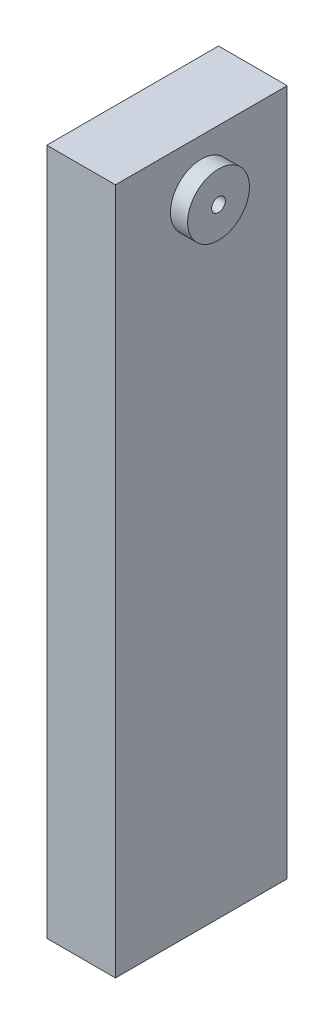
ISO-10303-21;
HEADER;
FILE_DESCRIPTION(('STEP AP214'),'2;1');
FILE_NAME('part.step','',(''),(''),'','','');
FILE_SCHEMA(('AUTOMOTIVE_DESIGN { 1 0 10303 214 1 1 1 1 }'));
ENDSEC;
DATA;
#1=APPLICATION_CONTEXT('core data for automotive mechanical design processes');
#2=APPLICATION_PROTOCOL_DEFINITION('international standard','automotive_design',2000,#1);
#3=PRODUCT_CONTEXT('',#1,'mechanical');
#4=PRODUCT('Part','Part','',(#3));
#5=PRODUCT_RELATED_PRODUCT_CATEGORY('part','',(#4));
#6=PRODUCT_DEFINITION_FORMATION('','',#4);
#7=PRODUCT_DEFINITION_CONTEXT('part definition',#1,'design');
#8=PRODUCT_DEFINITION('design','',#6,#7);
#9=PRODUCT_DEFINITION_SHAPE('','',#8);
#10=(LENGTH_UNIT() NAMED_UNIT(*) SI_UNIT(.MILLI.,.METRE.));
#11=(NAMED_UNIT(*) PLANE_ANGLE_UNIT() SI_UNIT($,.RADIAN.));
#12=(NAMED_UNIT(*) SI_UNIT($,.STERADIAN.) SOLID_ANGLE_UNIT());
#13=UNCERTAINTY_MEASURE_WITH_UNIT(LENGTH_MEASURE(1.E-05),#10,'distance_accuracy_value','');
#14=(GEOMETRIC_REPRESENTATION_CONTEXT(3) GLOBAL_UNCERTAINTY_ASSIGNED_CONTEXT((#13)) GLOBAL_UNIT_ASSIGNED_CONTEXT((#10,
#11,#12)) REPRESENTATION_CONTEXT('',''));
#15=CARTESIAN_POINT('',(0.,0.,0.));
#16=DIRECTION('',(0.,0.,1.));
#17=DIRECTION('',(1.,0.,0.));
#18=AXIS2_PLACEMENT_3D('',#15,#16,#17);
#19=CARTESIAN_POINT('',(-50.,1000.,125.));
#20=DIRECTION('',(1.,0.,0.));
#21=DIRECTION('',(0.,0.,-1.));
#22=AXIS2_PLACEMENT_3D('',#19,#20,#21);
#23=PLANE('',#22);
#24=DIRECTION('',(0.,0.,1.));
#25=VECTOR('',#24,1.);
#26=CARTESIAN_POINT('',(-50.,0.,125.));
#27=LINE('',#26,#25);
#28=CARTESIAN_POINT('',(-50.,0.,-125.));
#29=VERTEX_POINT('',#28);
#30=CARTESIAN_POINT('',(-50.,0.,125.));
#31=VERTEX_POINT('',#30);
#32=EDGE_CURVE('E102',#29,#31,#27,.T.);
#33=ORIENTED_EDGE('',*,*,#32,.T.);
#34=DIRECTION('',(0.,-1.,0.));
#35=VECTOR('',#34,1.);
#36=CARTESIAN_POINT('',(-50.,1000.,125.));
#37=LINE('',#36,#35);
#38=CARTESIAN_POINT('',(-50.,1000.,125.));
#39=VERTEX_POINT('',#38);
#40=EDGE_CURVE('E44',#39,#31,#37,.T.);
#41=ORIENTED_EDGE('',*,*,#40,.F.);
#42=DIRECTION('',(0.,0.,1.));
#43=VECTOR('',#42,1.);
#44=CARTESIAN_POINT('',(-50.,1000.,125.));
#45=LINE('',#44,#43);
#46=CARTESIAN_POINT('',(-50.,1000.,-125.));
#47=VERTEX_POINT('',#46);
#48=EDGE_CURVE('E88',#47,#39,#45,.T.);
#49=ORIENTED_EDGE('',*,*,#48,.F.);
#50=DIRECTION('',(0.,-1.,0.));
#51=VECTOR('',#50,1.);
#52=CARTESIAN_POINT('',(-50.,1000.,-125.));
#53=LINE('',#52,#51);
#54=EDGE_CURVE('E98',#47,#29,#53,.T.);
#55=ORIENTED_EDGE('',*,*,#54,.T.);
#56=EDGE_LOOP('',(#33,#41,#49,#55));
#57=FACE_BOUND('',#56,.T.);
#58=ADVANCED_FACE('F36',(#57),#23,.F.);
#59=CARTESIAN_POINT('',(50.,1000.,125.));
#60=DIRECTION('',(0.,0.,-1.));
#61=DIRECTION('',(-1.,0.,0.));
#62=AXIS2_PLACEMENT_3D('',#59,#60,#61);
#63=PLANE('',#62);
#64=DIRECTION('',(1.,0.,0.));
#65=VECTOR('',#64,1.);
#66=CARTESIAN_POINT('',(50.,0.,125.));
#67=LINE('',#66,#65);
#68=CARTESIAN_POINT('',(50.,0.,125.));
#69=VERTEX_POINT('',#68);
#70=EDGE_CURVE('E93',#31,#69,#67,.T.);
#71=ORIENTED_EDGE('',*,*,#70,.T.);
#72=DIRECTION('',(0.,-1.,0.));
#73=VECTOR('',#72,1.);
#74=CARTESIAN_POINT('',(50.,1000.,125.));
#75=LINE('',#74,#73);
#76=CARTESIAN_POINT('',(50.,1000.,125.));
#77=VERTEX_POINT('',#76);
#78=EDGE_CURVE('E91',#77,#69,#75,.T.);
#79=ORIENTED_EDGE('',*,*,#78,.F.);
#80=DIRECTION('',(1.,0.,0.));
#81=VECTOR('',#80,1.);
#82=CARTESIAN_POINT('',(50.,1000.,125.));
#83=LINE('',#82,#81);
#84=EDGE_CURVE('E83',#39,#77,#83,.T.);
#85=ORIENTED_EDGE('',*,*,#84,.F.);
#86=ORIENTED_EDGE('',*,*,#40,.T.);
#87=EDGE_LOOP('',(#71,#79,#85,#86));
#88=FACE_BOUND('',#87,.T.);
#89=ADVANCED_FACE('F92',(#88),#63,.F.);
#90=CARTESIAN_POINT('',(50.,1000.,125.));
#91=DIRECTION('',(-1.,0.,0.));
#92=DIRECTION('',(0.,0.,1.));
#93=AXIS2_PLACEMENT_3D('',#90,#91,#92);
#94=PLANE('',#93);
#95=CARTESIAN_POINT('',(50.,925.,0.));
#96=DIRECTION('',(-1.,0.,0.));
#97=DIRECTION('',(0.,0.,1.));
#98=AXIS2_PLACEMENT_3D('',#95,#96,#97);
#99=CIRCLE('',#98,45.);
#100=CARTESIAN_POINT('',(50.,925.,45.));
#101=VERTEX_POINT('',#100);
#102=EDGE_CURVE('E11',#101,#101,#99,.F.);
#103=ORIENTED_EDGE('',*,*,#102,.F.);
#104=EDGE_LOOP('',(#103));
#105=FACE_BOUND('',#104,.T.);
#106=DIRECTION('',(0.,0.,-1.));
#107=VECTOR('',#106,1.);
#108=CARTESIAN_POINT('',(50.,0.,125.));
#109=LINE('',#108,#107);
#110=CARTESIAN_POINT('',(50.,0.,-125.));
#111=VERTEX_POINT('',#110);
#112=EDGE_CURVE('E69',#69,#111,#109,.T.);
#113=ORIENTED_EDGE('',*,*,#112,.T.);
#114=DIRECTION('',(0.,-1.,0.));
#115=VECTOR('',#114,1.);
#116=CARTESIAN_POINT('',(50.,1000.,-125.));
#117=LINE('',#116,#115);
#118=CARTESIAN_POINT('',(50.,1000.,-125.));
#119=VERTEX_POINT('',#118);
#120=EDGE_CURVE('E94',#119,#111,#117,.T.);
#121=ORIENTED_EDGE('',*,*,#120,.F.);
#122=DIRECTION('',(0.,0.,-1.));
#123=VECTOR('',#122,1.);
#124=CARTESIAN_POINT('',(50.,1000.,125.));
#125=LINE('',#124,#123);
#126=EDGE_CURVE('E86',#77,#119,#125,.T.);
#127=ORIENTED_EDGE('',*,*,#126,.F.);
#128=ORIENTED_EDGE('',*,*,#78,.T.);
#129=EDGE_LOOP('',(#113,#121,#127,#128));
#130=FACE_BOUND('',#129,.T.);
#131=ADVANCED_FACE('F96',(#105,#130),#94,.F.);
#132=CARTESIAN_POINT('',(50.,1000.,-125.));
#133=DIRECTION('',(0.,0.,1.));
#134=DIRECTION('',(1.,0.,0.));
#135=AXIS2_PLACEMENT_3D('',#132,#133,#134);
#136=PLANE('',#135);
#137=DIRECTION('',(-1.,0.,0.));
#138=VECTOR('',#137,1.);
#139=CARTESIAN_POINT('',(50.,0.,-125.));
#140=LINE('',#139,#138);
#141=EDGE_CURVE('E75',#111,#29,#140,.T.);
#142=ORIENTED_EDGE('',*,*,#141,.T.);
#143=ORIENTED_EDGE('',*,*,#54,.F.);
#144=DIRECTION('',(-1.,0.,0.));
#145=VECTOR('',#144,1.);
#146=CARTESIAN_POINT('',(50.,1000.,-125.));
#147=LINE('',#146,#145);
#148=EDGE_CURVE('E52',#119,#47,#147,.T.);
#149=ORIENTED_EDGE('',*,*,#148,.F.);
#150=ORIENTED_EDGE('',*,*,#120,.T.);
#151=EDGE_LOOP('',(#142,#143,#149,#150));
#152=FACE_BOUND('',#151,.T.);
#153=ADVANCED_FACE('F124',(#152),#136,.F.);
#154=CARTESIAN_POINT('',(0.,1000.,0.));
#155=DIRECTION('',(0.,1.,0.));
#156=DIRECTION('',(0.,0.,1.));
#157=AXIS2_PLACEMENT_3D('',#154,#155,#156);
#158=PLANE('',#157);
#159=ORIENTED_EDGE('',*,*,#48,.T.);
#160=ORIENTED_EDGE('',*,*,#84,.T.);
#161=ORIENTED_EDGE('',*,*,#126,.T.);
#162=ORIENTED_EDGE('',*,*,#148,.T.);
#163=EDGE_LOOP('',(#159,#160,#161,#162));
#164=FACE_BOUND('',#163,.T.);
#165=ADVANCED_FACE('F84',(#164),#158,.T.);
#166=CARTESIAN_POINT('',(0.,0.,0.));
#167=DIRECTION('',(0.,1.,0.));
#168=DIRECTION('',(0.,0.,1.));
#169=AXIS2_PLACEMENT_3D('',#166,#167,#168);
#170=PLANE('',#169);
#171=ORIENTED_EDGE('',*,*,#32,.F.);
#172=ORIENTED_EDGE('',*,*,#141,.F.);
#173=ORIENTED_EDGE('',*,*,#112,.F.);
#174=ORIENTED_EDGE('',*,*,#70,.F.);
#175=EDGE_LOOP('',(#171,#172,#173,#174));
#176=FACE_BOUND('',#175,.T.);
#177=ADVANCED_FACE('F113',(#176),#170,.F.);
#178=CARTESIAN_POINT('',(75.,925.,0.));
#179=DIRECTION('',(-1.,0.,0.));
#180=DIRECTION('',(0.,0.,1.));
#181=AXIS2_PLACEMENT_3D('',#178,#179,#180);
#182=CYLINDRICAL_SURFACE('',#181,45.);
#183=CARTESIAN_POINT('',(75.,925.,0.));
#184=DIRECTION('',(1.,0.,0.));
#185=DIRECTION('',(0.,0.,-1.));
#186=AXIS2_PLACEMENT_3D('',#183,#184,#185);
#187=CIRCLE('',#186,45.);
#188=CARTESIAN_POINT('',(75.,925.,-45.));
#189=VERTEX_POINT('',#188);
#190=EDGE_CURVE('E105',#189,#189,#187,.T.);
#191=ORIENTED_EDGE('',*,*,#190,.F.);
#192=EDGE_LOOP('',(#191));
#193=FACE_BOUND('',#192,.T.);
#194=ORIENTED_EDGE('',*,*,#102,.T.);
#195=EDGE_LOOP('',(#194));
#196=FACE_BOUND('',#195,.T.);
#197=ADVANCED_FACE('F115',(#193,#196),#182,.T.);
#198=CARTESIAN_POINT('',(75.,925.,0.));
#199=DIRECTION('',(1.,0.,0.));
#200=DIRECTION('',(0.,0.,-1.));
#201=AXIS2_PLACEMENT_3D('',#198,#199,#200);
#202=PLANE('',#201);
#203=CARTESIAN_POINT('',(75.,925.,0.));
#204=DIRECTION('',(1.,0.,0.));
#205=DIRECTION('',(0.,0.,-1.));
#206=AXIS2_PLACEMENT_3D('',#203,#204,#205);
#207=CIRCLE('',#206,10.);
#208=CARTESIAN_POINT('',(75.,925.,-10.));
#209=VERTEX_POINT('',#208);
#210=EDGE_CURVE('E196',#209,#209,#207,.T.);
#211=ORIENTED_EDGE('',*,*,#210,.F.);
#212=EDGE_LOOP('',(#211));
#213=FACE_BOUND('',#212,.T.);
#214=ORIENTED_EDGE('',*,*,#190,.T.);
#215=EDGE_LOOP('',(#214));
#216=FACE_BOUND('',#215,.T.);
#217=ADVANCED_FACE('F121',(#213,#216),#202,.T.);
#218=CARTESIAN_POINT('',(50.,925.,0.));
#219=DIRECTION('',(1.,0.,0.));
#220=DIRECTION('',(0.,0.,-1.));
#221=AXIS2_PLACEMENT_3D('',#218,#219,#220);
#222=CYLINDRICAL_SURFACE('',#221,10.);
#223=CARTESIAN_POINT('',(50.,925.,0.));
#224=DIRECTION('',(1.,0.,0.));
#225=DIRECTION('',(0.,0.,-1.));
#226=AXIS2_PLACEMENT_3D('',#223,#224,#225);
#227=CIRCLE('',#226,10.);
#228=CARTESIAN_POINT('',(50.,925.,-10.));
#229=VERTEX_POINT('',#228);
#230=EDGE_CURVE('E195',#229,#229,#227,.T.);
#231=ORIENTED_EDGE('',*,*,#230,.F.);
#232=EDGE_LOOP('',(#231));
#233=FACE_BOUND('',#232,.T.);
#234=ORIENTED_EDGE('',*,*,#210,.T.);
#235=EDGE_LOOP('',(#234));
#236=FACE_BOUND('',#235,.T.);
#237=ADVANCED_FACE('F169',(#233,#236),#222,.F.);
#238=CARTESIAN_POINT('',(50.,925.,0.));
#239=DIRECTION('',(1.,0.,0.));
#240=DIRECTION('',(0.,0.,-1.));
#241=AXIS2_PLACEMENT_3D('',#238,#239,#240);
#242=PLANE('',#241);
#243=ORIENTED_EDGE('',*,*,#230,.T.);
#244=EDGE_LOOP('',(#243));
#245=FACE_BOUND('',#244,.T.);
#246=ADVANCED_FACE('F179',(#245),#242,.T.);
#247=CLOSED_SHELL('',(#58,#89,#131,#153,#165,#177,#197,#217,#237,#246));
#248=MANIFOLD_SOLID_BREP('B2',#247);
#249=ADVANCED_BREP_SHAPE_REPRESENTATION('',(#18,#248),#14);
#250=SHAPE_DEFINITION_REPRESENTATION(#9,#249);
ENDSEC;
END-ISO-10303-21;
